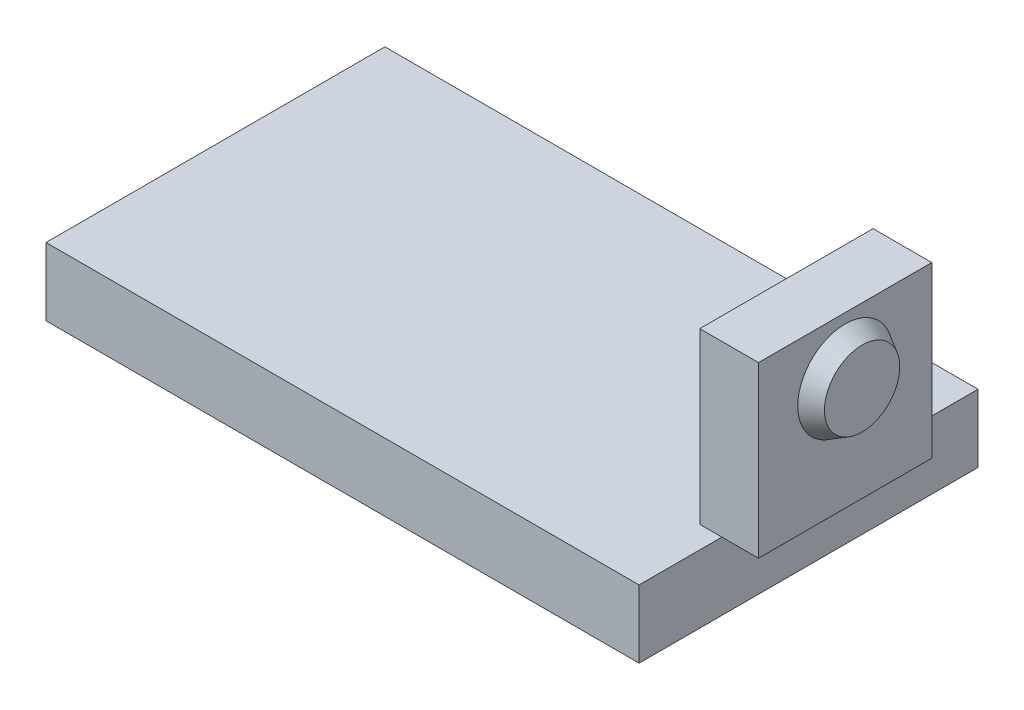
ISO-10303-21;
HEADER;
FILE_DESCRIPTION(('STEP AP214'),'2;1');
FILE_NAME('part.step','',(''),(''),'','','');
FILE_SCHEMA(('AUTOMOTIVE_DESIGN { 1 0 10303 214 1 1 1 1 }'));
ENDSEC;
DATA;
#1=APPLICATION_CONTEXT('core data for automotive mechanical design processes');
#2=APPLICATION_PROTOCOL_DEFINITION('international standard','automotive_design',2000,#1);
#3=PRODUCT_CONTEXT('',#1,'mechanical');
#4=PRODUCT('Part','Part','',(#3));
#5=PRODUCT_RELATED_PRODUCT_CATEGORY('part','',(#4));
#6=PRODUCT_DEFINITION_FORMATION('','',#4);
#7=PRODUCT_DEFINITION_CONTEXT('part definition',#1,'design');
#8=PRODUCT_DEFINITION('design','',#6,#7);
#9=PRODUCT_DEFINITION_SHAPE('','',#8);
#10=(LENGTH_UNIT() NAMED_UNIT(*) SI_UNIT(.MILLI.,.METRE.));
#11=(NAMED_UNIT(*) PLANE_ANGLE_UNIT() SI_UNIT($,.RADIAN.));
#12=(NAMED_UNIT(*) SI_UNIT($,.STERADIAN.) SOLID_ANGLE_UNIT());
#13=UNCERTAINTY_MEASURE_WITH_UNIT(LENGTH_MEASURE(1.E-05),#10,'distance_accuracy_value','');
#14=(GEOMETRIC_REPRESENTATION_CONTEXT(3) GLOBAL_UNCERTAINTY_ASSIGNED_CONTEXT((#13)) GLOBAL_UNIT_ASSIGNED_CONTEXT((#10,
#11,#12)) REPRESENTATION_CONTEXT('',''));
#15=CARTESIAN_POINT('',(0.,0.,0.));
#16=DIRECTION('',(0.,0.,1.));
#17=DIRECTION('',(1.,0.,0.));
#18=AXIS2_PLACEMENT_3D('',#15,#16,#17);
#19=CARTESIAN_POINT('',(17.5,4.,-10.));
#20=DIRECTION('',(-1.,0.,0.));
#21=DIRECTION('',(0.,0.,1.));
#22=AXIS2_PLACEMENT_3D('',#19,#20,#21);
#23=PLANE('',#22);
#24=DIRECTION('',(0.,0.,-1.));
#25=VECTOR('',#24,1.);
#26=CARTESIAN_POINT('',(17.5,0.,-10.));
#27=LINE('',#26,#25);
#28=CARTESIAN_POINT('',(17.5,0.,10.));
#29=VERTEX_POINT('',#28);
#30=CARTESIAN_POINT('',(17.5,0.,-10.));
#31=VERTEX_POINT('',#30);
#32=EDGE_CURVE('E127',#29,#31,#27,.T.);
#33=ORIENTED_EDGE('',*,*,#32,.T.);
#34=DIRECTION('',(0.,-1.,0.));
#35=VECTOR('',#34,1.);
#36=CARTESIAN_POINT('',(17.5,4.,-10.));
#37=LINE('',#36,#35);
#38=CARTESIAN_POINT('',(17.5,4.,-10.));
#39=VERTEX_POINT('',#38);
#40=EDGE_CURVE('E159',#39,#31,#37,.T.);
#41=ORIENTED_EDGE('',*,*,#40,.F.);
#42=DIRECTION('',(0.,0.,-1.));
#43=VECTOR('',#42,1.);
#44=CARTESIAN_POINT('',(17.5,4.,-10.));
#45=LINE('',#44,#43);
#46=CARTESIAN_POINT('',(17.5,4.,-5.1129838733543));
#47=VERTEX_POINT('',#46);
#48=EDGE_CURVE('E140',#47,#39,#45,.T.);
#49=ORIENTED_EDGE('',*,*,#48,.F.);
#50=CARTESIAN_POINT('',(17.5,4.,5.1129838733543));
#51=VERTEX_POINT('',#50);
#52=EDGE_CURVE('E139',#51,#47,#45,.T.);
#53=ORIENTED_EDGE('',*,*,#52,.F.);
#54=CARTESIAN_POINT('',(17.5,4.,10.));
#55=VERTEX_POINT('',#54);
#56=EDGE_CURVE('E136',#55,#51,#45,.T.);
#57=ORIENTED_EDGE('',*,*,#56,.F.);
#58=DIRECTION('',(0.,-1.,0.));
#59=VECTOR('',#58,1.);
#60=CARTESIAN_POINT('',(17.5,4.,10.));
#61=LINE('',#60,#59);
#62=EDGE_CURVE('E145',#55,#29,#61,.T.);
#63=ORIENTED_EDGE('',*,*,#62,.T.);
#64=EDGE_LOOP('',(#33,#41,#49,#53,#57,#63));
#65=FACE_BOUND('',#64,.T.);
#66=ADVANCED_FACE('F33',(#65),#23,.F.);
#67=CARTESIAN_POINT('',(-17.5,4.,-10.));
#68=DIRECTION('',(0.,0.,1.));
#69=DIRECTION('',(1.,0.,0.));
#70=AXIS2_PLACEMENT_3D('',#67,#68,#69);
#71=PLANE('',#70);
#72=DIRECTION('',(-1.,0.,0.));
#73=VECTOR('',#72,1.);
#74=CARTESIAN_POINT('',(-17.5,0.,-10.));
#75=LINE('',#74,#73);
#76=CARTESIAN_POINT('',(-17.5,0.,-10.));
#77=VERTEX_POINT('',#76);
#78=EDGE_CURVE('E130',#31,#77,#75,.T.);
#79=ORIENTED_EDGE('',*,*,#78,.T.);
#80=DIRECTION('',(0.,-1.,0.));
#81=VECTOR('',#80,1.);
#82=CARTESIAN_POINT('',(-17.5,4.,-10.));
#83=LINE('',#82,#81);
#84=CARTESIAN_POINT('',(-17.5,4.,-10.));
#85=VERTEX_POINT('',#84);
#86=EDGE_CURVE('E157',#85,#77,#83,.T.);
#87=ORIENTED_EDGE('',*,*,#86,.F.);
#88=DIRECTION('',(-1.,0.,0.));
#89=VECTOR('',#88,1.);
#90=CARTESIAN_POINT('',(-17.5,4.,-10.));
#91=LINE('',#90,#89);
#92=EDGE_CURVE('E138',#39,#85,#91,.T.);
#93=ORIENTED_EDGE('',*,*,#92,.F.);
#94=ORIENTED_EDGE('',*,*,#40,.T.);
#95=EDGE_LOOP('',(#79,#87,#93,#94));
#96=FACE_BOUND('',#95,.T.);
#97=ADVANCED_FACE('F192',(#96),#71,.F.);
#98=CARTESIAN_POINT('',(-17.5,4.,-10.));
#99=DIRECTION('',(1.,0.,0.));
#100=DIRECTION('',(0.,0.,-1.));
#101=AXIS2_PLACEMENT_3D('',#98,#99,#100);
#102=PLANE('',#101);
#103=DIRECTION('',(0.,0.,1.));
#104=VECTOR('',#103,1.);
#105=CARTESIAN_POINT('',(-17.5,0.,-10.));
#106=LINE('',#105,#104);
#107=CARTESIAN_POINT('',(-17.5,0.,10.));
#108=VERTEX_POINT('',#107);
#109=EDGE_CURVE('E148',#77,#108,#106,.T.);
#110=ORIENTED_EDGE('',*,*,#109,.T.);
#111=DIRECTION('',(0.,-1.,0.));
#112=VECTOR('',#111,1.);
#113=CARTESIAN_POINT('',(-17.5,4.,10.));
#114=LINE('',#113,#112);
#115=CARTESIAN_POINT('',(-17.5,4.,10.));
#116=VERTEX_POINT('',#115);
#117=EDGE_CURVE('E154',#116,#108,#114,.T.);
#118=ORIENTED_EDGE('',*,*,#117,.F.);
#119=DIRECTION('',(0.,0.,1.));
#120=VECTOR('',#119,1.);
#121=CARTESIAN_POINT('',(-17.5,4.,-10.));
#122=LINE('',#121,#120);
#123=EDGE_CURVE('E142',#85,#116,#122,.T.);
#124=ORIENTED_EDGE('',*,*,#123,.F.);
#125=ORIENTED_EDGE('',*,*,#86,.T.);
#126=EDGE_LOOP('',(#110,#118,#124,#125));
#127=FACE_BOUND('',#126,.T.);
#128=ADVANCED_FACE('F201',(#127),#102,.F.);
#129=CARTESIAN_POINT('',(-17.5,4.,10.));
#130=DIRECTION('',(0.,0.,-1.));
#131=DIRECTION('',(-1.,0.,0.));
#132=AXIS2_PLACEMENT_3D('',#129,#130,#131);
#133=PLANE('',#132);
#134=DIRECTION('',(1.,0.,0.));
#135=VECTOR('',#134,1.);
#136=CARTESIAN_POINT('',(-17.5,0.,10.));
#137=LINE('',#136,#135);
#138=EDGE_CURVE('E150',#108,#29,#137,.T.);
#139=ORIENTED_EDGE('',*,*,#138,.T.);
#140=ORIENTED_EDGE('',*,*,#62,.F.);
#141=DIRECTION('',(1.,0.,0.));
#142=VECTOR('',#141,1.);
#143=CARTESIAN_POINT('',(-17.5,4.,10.));
#144=LINE('',#143,#142);
#145=EDGE_CURVE('E144',#116,#55,#144,.T.);
#146=ORIENTED_EDGE('',*,*,#145,.F.);
#147=ORIENTED_EDGE('',*,*,#117,.T.);
#148=EDGE_LOOP('',(#139,#140,#146,#147));
#149=FACE_BOUND('',#148,.T.);
#150=ADVANCED_FACE('F205',(#149),#133,.F.);
#151=CARTESIAN_POINT('',(0.,4.,0.));
#152=DIRECTION('',(0.,1.,0.));
#153=DIRECTION('',(0.,0.,1.));
#154=AXIS2_PLACEMENT_3D('',#151,#152,#153);
#155=PLANE('',#154);
#156=DIRECTION('',(1.,0.,0.));
#157=VECTOR('',#156,1.);
#158=CARTESIAN_POINT('',(16.1941057360559,4.,5.1129838733543));
#159=LINE('',#158,#157);
#160=CARTESIAN_POINT('',(16.1941057360559,4.,5.1129838733543));
#161=VERTEX_POINT('',#160);
#162=EDGE_CURVE('E47',#161,#51,#159,.T.);
#163=ORIENTED_EDGE('',*,*,#162,.F.);
#164=DIRECTION('',(0.,0.,1.));
#165=VECTOR('',#164,1.);
#166=CARTESIAN_POINT('',(16.1941057360559,4.,-5.1129838733543));
#167=LINE('',#166,#165);
#168=CARTESIAN_POINT('',(16.1941057360559,4.,-5.1129838733543));
#169=VERTEX_POINT('',#168);
#170=EDGE_CURVE('E168',#169,#161,#167,.T.);
#171=ORIENTED_EDGE('',*,*,#170,.F.);
#172=DIRECTION('',(-1.,0.,0.));
#173=VECTOR('',#172,1.);
#174=CARTESIAN_POINT('',(16.1941057360559,4.,-5.1129838733543));
#175=LINE('',#174,#173);
#176=EDGE_CURVE('E40',#47,#169,#175,.T.);
#177=ORIENTED_EDGE('',*,*,#176,.F.);
#178=ORIENTED_EDGE('',*,*,#48,.T.);
#179=ORIENTED_EDGE('',*,*,#92,.T.);
#180=ORIENTED_EDGE('',*,*,#123,.T.);
#181=ORIENTED_EDGE('',*,*,#145,.T.);
#182=ORIENTED_EDGE('',*,*,#56,.T.);
#183=EDGE_LOOP('',(#163,#171,#177,#178,#179,#180,#181,#182));
#184=FACE_BOUND('',#183,.T.);
#185=ADVANCED_FACE('F190',(#184),#155,.T.);
#186=CARTESIAN_POINT('',(0.,0.,0.));
#187=DIRECTION('',(0.,1.,0.));
#188=DIRECTION('',(0.,0.,1.));
#189=AXIS2_PLACEMENT_3D('',#186,#187,#188);
#190=PLANE('',#189);
#191=ORIENTED_EDGE('',*,*,#32,.F.);
#192=ORIENTED_EDGE('',*,*,#138,.F.);
#193=ORIENTED_EDGE('',*,*,#109,.F.);
#194=ORIENTED_EDGE('',*,*,#78,.F.);
#195=EDGE_LOOP('',(#191,#192,#193,#194));
#196=FACE_BOUND('',#195,.T.);
#197=ADVANCED_FACE('F198',(#196),#190,.F.);
#198=CARTESIAN_POINT('',(0.,4.,0.));
#199=DIRECTION('',(0.,1.,0.));
#200=DIRECTION('',(0.,0.,1.));
#201=AXIS2_PLACEMENT_3D('',#198,#199,#200);
#202=PLANE('',#201);
#203=CARTESIAN_POINT('',(19.6609275341082,4.,5.1129838733543));
#204=VERTEX_POINT('',#203);
#205=EDGE_CURVE('E169',#51,#204,#159,.T.);
#206=ORIENTED_EDGE('',*,*,#205,.F.);
#207=ORIENTED_EDGE('',*,*,#52,.T.);
#208=CARTESIAN_POINT('',(19.6609275341082,4.,-5.1129838733543));
#209=VERTEX_POINT('',#208);
#210=EDGE_CURVE('E165',#209,#47,#175,.T.);
#211=ORIENTED_EDGE('',*,*,#210,.F.);
#212=DIRECTION('',(0.,0.,-1.));
#213=VECTOR('',#212,1.);
#214=CARTESIAN_POINT('',(19.6609275341082,4.,-5.1129838733543));
#215=LINE('',#214,#213);
#216=EDGE_CURVE('E126',#204,#209,#215,.T.);
#217=ORIENTED_EDGE('',*,*,#216,.F.);
#218=EDGE_LOOP('',(#206,#207,#211,#217));
#219=FACE_BOUND('',#218,.T.);
#220=ADVANCED_FACE('F186',(#219),#202,.F.);
#221=CARTESIAN_POINT('',(19.6609275341082,14.,-5.1129838733543));
#222=DIRECTION('',(-1.,0.,0.));
#223=DIRECTION('',(0.,0.,1.));
#224=AXIS2_PLACEMENT_3D('',#221,#222,#223);
#225=PLANE('',#224);
#226=CARTESIAN_POINT('',(19.6609275341082,10.6174937583887,0.));
#227=DIRECTION('',(-1.,0.,0.));
#228=DIRECTION('',(0.,0.,1.));
#229=AXIS2_PLACEMENT_3D('',#226,#227,#228);
#230=CIRCLE('',#229,2.80007344047561);
#231=CARTESIAN_POINT('',(19.6609275341082,10.6174937583887,2.80007344047561));
#232=VERTEX_POINT('',#231);
#233=EDGE_CURVE('E11',#232,#232,#230,.F.);
#234=ORIENTED_EDGE('',*,*,#233,.F.);
#235=EDGE_LOOP('',(#234));
#236=FACE_BOUND('',#235,.T.);
#237=ORIENTED_EDGE('',*,*,#216,.T.);
#238=DIRECTION('',(0.,-1.,0.));
#239=VECTOR('',#238,1.);
#240=CARTESIAN_POINT('',(19.6609275341082,14.,-5.1129838733543));
#241=LINE('',#240,#239);
#242=CARTESIAN_POINT('',(19.6609275341082,14.,-5.1129838733543));
#243=VERTEX_POINT('',#242);
#244=EDGE_CURVE('E107',#243,#209,#241,.T.);
#245=ORIENTED_EDGE('',*,*,#244,.F.);
#246=DIRECTION('',(0.,0.,-1.));
#247=VECTOR('',#246,1.);
#248=CARTESIAN_POINT('',(19.6609275341082,14.,-5.1129838733543));
#249=LINE('',#248,#247);
#250=CARTESIAN_POINT('',(19.6609275341082,14.,5.1129838733543));
#251=VERTEX_POINT('',#250);
#252=EDGE_CURVE('E114',#251,#243,#249,.T.);
#253=ORIENTED_EDGE('',*,*,#252,.F.);
#254=DIRECTION('',(0.,-1.,0.));
#255=VECTOR('',#254,1.);
#256=CARTESIAN_POINT('',(19.6609275341082,14.,5.1129838733543));
#257=LINE('',#256,#255);
#258=EDGE_CURVE('E175',#251,#204,#257,.T.);
#259=ORIENTED_EDGE('',*,*,#258,.T.);
#260=EDGE_LOOP('',(#237,#245,#253,#259));
#261=FACE_BOUND('',#260,.T.);
#262=ADVANCED_FACE('F124',(#236,#261),#225,.F.);
#263=CARTESIAN_POINT('',(16.1941057360559,14.,-5.1129838733543));
#264=DIRECTION('',(0.,0.,1.));
#265=DIRECTION('',(1.,0.,0.));
#266=AXIS2_PLACEMENT_3D('',#263,#264,#265);
#267=PLANE('',#266);
#268=ORIENTED_EDGE('',*,*,#210,.T.);
#269=ORIENTED_EDGE('',*,*,#176,.T.);
#270=DIRECTION('',(0.,-1.,0.));
#271=VECTOR('',#270,1.);
#272=CARTESIAN_POINT('',(16.1941057360559,14.,-5.1129838733543));
#273=LINE('',#272,#271);
#274=CARTESIAN_POINT('',(16.1941057360559,14.,-5.1129838733543));
#275=VERTEX_POINT('',#274);
#276=EDGE_CURVE('E110',#275,#169,#273,.T.);
#277=ORIENTED_EDGE('',*,*,#276,.F.);
#278=DIRECTION('',(-1.,0.,0.));
#279=VECTOR('',#278,1.);
#280=CARTESIAN_POINT('',(16.1941057360559,14.,-5.1129838733543));
#281=LINE('',#280,#279);
#282=EDGE_CURVE('E102',#243,#275,#281,.T.);
#283=ORIENTED_EDGE('',*,*,#282,.F.);
#284=ORIENTED_EDGE('',*,*,#244,.T.);
#285=EDGE_LOOP('',(#268,#269,#277,#283,#284));
#286=FACE_BOUND('',#285,.T.);
#287=ADVANCED_FACE('F105',(#286),#267,.F.);
#288=CARTESIAN_POINT('',(16.1941057360559,14.,-5.1129838733543));
#289=DIRECTION('',(1.,0.,0.));
#290=DIRECTION('',(0.,0.,-1.));
#291=AXIS2_PLACEMENT_3D('',#288,#289,#290);
#292=PLANE('',#291);
#293=ORIENTED_EDGE('',*,*,#170,.T.);
#294=DIRECTION('',(0.,-1.,0.));
#295=VECTOR('',#294,1.);
#296=CARTESIAN_POINT('',(16.1941057360559,14.,5.1129838733543));
#297=LINE('',#296,#295);
#298=CARTESIAN_POINT('',(16.1941057360559,14.,5.1129838733543));
#299=VERTEX_POINT('',#298);
#300=EDGE_CURVE('E132',#299,#161,#297,.T.);
#301=ORIENTED_EDGE('',*,*,#300,.F.);
#302=DIRECTION('',(0.,0.,1.));
#303=VECTOR('',#302,1.);
#304=CARTESIAN_POINT('',(16.1941057360559,14.,-5.1129838733543));
#305=LINE('',#304,#303);
#306=EDGE_CURVE('E113',#275,#299,#305,.T.);
#307=ORIENTED_EDGE('',*,*,#306,.F.);
#308=ORIENTED_EDGE('',*,*,#276,.T.);
#309=EDGE_LOOP('',(#293,#301,#307,#308));
#310=FACE_BOUND('',#309,.T.);
#311=ADVANCED_FACE('F179',(#310),#292,.F.);
#312=CARTESIAN_POINT('',(16.1941057360559,14.,5.1129838733543));
#313=DIRECTION('',(0.,0.,-1.));
#314=DIRECTION('',(-1.,0.,0.));
#315=AXIS2_PLACEMENT_3D('',#312,#313,#314);
#316=PLANE('',#315);
#317=ORIENTED_EDGE('',*,*,#162,.T.);
#318=ORIENTED_EDGE('',*,*,#205,.T.);
#319=ORIENTED_EDGE('',*,*,#258,.F.);
#320=DIRECTION('',(1.,0.,0.));
#321=VECTOR('',#320,1.);
#322=CARTESIAN_POINT('',(16.1941057360559,14.,5.1129838733543));
#323=LINE('',#322,#321);
#324=EDGE_CURVE('E119',#299,#251,#323,.T.);
#325=ORIENTED_EDGE('',*,*,#324,.F.);
#326=ORIENTED_EDGE('',*,*,#300,.T.);
#327=EDGE_LOOP('',(#317,#318,#319,#325,#326));
#328=FACE_BOUND('',#327,.T.);
#329=ADVANCED_FACE('F181',(#328),#316,.F.);
#330=CARTESIAN_POINT('',(0.,14.,0.));
#331=DIRECTION('',(0.,1.,0.));
#332=DIRECTION('',(0.,0.,1.));
#333=AXIS2_PLACEMENT_3D('',#330,#331,#332);
#334=PLANE('',#333);
#335=ORIENTED_EDGE('',*,*,#252,.T.);
#336=ORIENTED_EDGE('',*,*,#282,.T.);
#337=ORIENTED_EDGE('',*,*,#306,.T.);
#338=ORIENTED_EDGE('',*,*,#324,.T.);
#339=EDGE_LOOP('',(#335,#336,#337,#338));
#340=FACE_BOUND('',#339,.T.);
#341=ADVANCED_FACE('F117',(#340),#334,.T.);
#342=CARTESIAN_POINT('',(19.6609275341082,10.6174937583887,0.));
#343=DIRECTION('',(-1.,0.,0.));
#344=DIRECTION('',(0.,0.,-1.));
#345=AXIS2_PLACEMENT_3D('',#342,#343,#344);
#346=CONICAL_SURFACE('',#345,2.80007344047561,0.5235987755983);
#347=CARTESIAN_POINT('',(20.6609275341082,10.6174937583887,0.));
#348=DIRECTION('',(1.,0.,0.));
#349=DIRECTION('',(0.,0.,-1.));
#350=AXIS2_PLACEMENT_3D('',#347,#348,#349);
#351=CIRCLE('',#350,2.22272317128599);
#352=CARTESIAN_POINT('',(20.6609275341082,10.6174937583887,-2.22272317128599));
#353=VERTEX_POINT('',#352);
#354=EDGE_CURVE('E170',#353,#353,#351,.T.);
#355=ORIENTED_EDGE('',*,*,#354,.F.);
#356=EDGE_LOOP('',(#355));
#357=FACE_BOUND('',#356,.T.);
#358=ORIENTED_EDGE('',*,*,#233,.T.);
#359=EDGE_LOOP('',(#358));
#360=FACE_BOUND('',#359,.T.);
#361=ADVANCED_FACE('F289',(#357,#360),#346,.T.);
#362=CARTESIAN_POINT('',(20.6609275341082,10.6174937583887,0.));
#363=DIRECTION('',(1.,0.,0.));
#364=DIRECTION('',(0.,0.,-1.));
#365=AXIS2_PLACEMENT_3D('',#362,#363,#364);
#366=PLANE('',#365);
#367=ORIENTED_EDGE('',*,*,#354,.T.);
#368=EDGE_LOOP('',(#367));
#369=FACE_BOUND('',#368,.T.);
#370=ADVANCED_FACE('F305',(#369),#366,.T.);
#371=CLOSED_SHELL('',(#66,#97,#128,#150,#185,#197,#220,#262,#287,#311,#329,#341,#361,#370));
#372=MANIFOLD_SOLID_BREP('B2',#371);
#373=ADVANCED_BREP_SHAPE_REPRESENTATION('',(#18,#372),#14);
#374=SHAPE_DEFINITION_REPRESENTATION(#9,#373);
ENDSEC;
END-ISO-10303-21;
